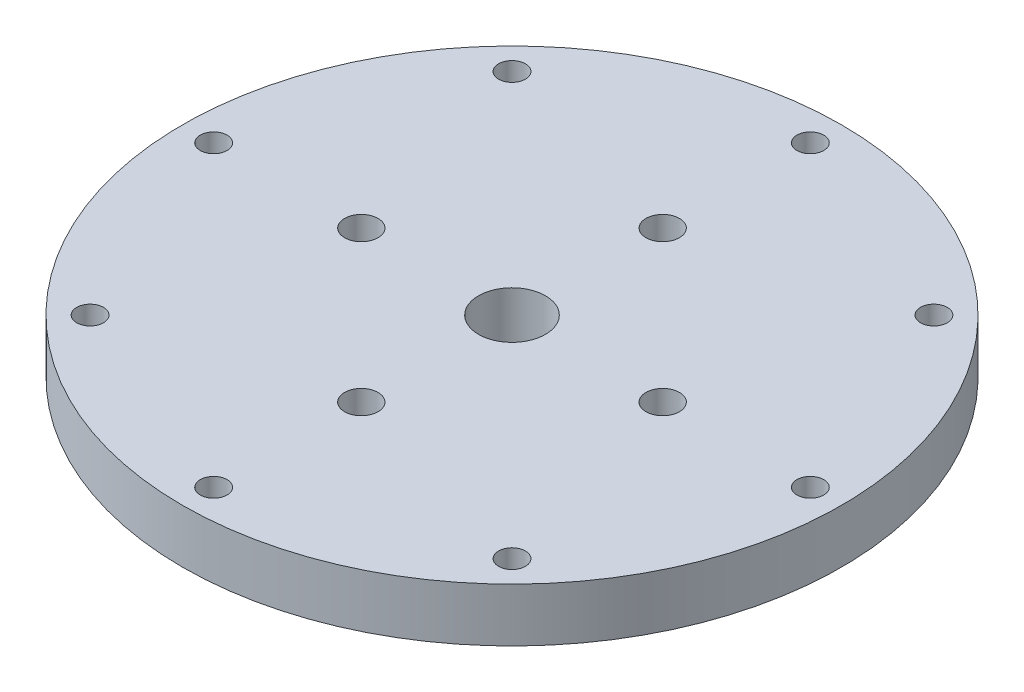
ISO-10303-21;
HEADER;
FILE_DESCRIPTION(('STEP AP214'),'2;1');
FILE_NAME('part.step','',(''),(''),'','','');
FILE_SCHEMA(('AUTOMOTIVE_DESIGN { 1 0 10303 214 1 1 1 1 }'));
ENDSEC;
DATA;
#1=APPLICATION_CONTEXT('core data for automotive mechanical design processes');
#2=APPLICATION_PROTOCOL_DEFINITION('international standard','automotive_design',2000,#1);
#3=PRODUCT_CONTEXT('',#1,'mechanical');
#4=PRODUCT('Part','Part','',(#3));
#5=PRODUCT_RELATED_PRODUCT_CATEGORY('part','',(#4));
#6=PRODUCT_DEFINITION_FORMATION('','',#4);
#7=PRODUCT_DEFINITION_CONTEXT('part definition',#1,'design');
#8=PRODUCT_DEFINITION('design','',#6,#7);
#9=PRODUCT_DEFINITION_SHAPE('','',#8);
#10=(LENGTH_UNIT() NAMED_UNIT(*) SI_UNIT(.MILLI.,.METRE.));
#11=(NAMED_UNIT(*) PLANE_ANGLE_UNIT() SI_UNIT($,.RADIAN.));
#12=(NAMED_UNIT(*) SI_UNIT($,.STERADIAN.) SOLID_ANGLE_UNIT());
#13=UNCERTAINTY_MEASURE_WITH_UNIT(LENGTH_MEASURE(1.E-05),#10,'distance_accuracy_value','');
#14=(GEOMETRIC_REPRESENTATION_CONTEXT(3) GLOBAL_UNCERTAINTY_ASSIGNED_CONTEXT((#13)) GLOBAL_UNIT_ASSIGNED_CONTEXT((#10,
#11,#12)) REPRESENTATION_CONTEXT('',''));
#15=CARTESIAN_POINT('',(0.,0.,0.));
#16=DIRECTION('',(0.,0.,1.));
#17=DIRECTION('',(1.,0.,0.));
#18=AXIS2_PLACEMENT_3D('',#15,#16,#17);
#19=CARTESIAN_POINT('',(0.,8.001,0.));
#20=DIRECTION('',(0.,1.,0.));
#21=DIRECTION('',(0.,0.,1.));
#22=AXIS2_PLACEMENT_3D('',#19,#20,#21);
#23=PLANE('',#22);
#24=CARTESIAN_POINT('',(22.5044,8.001,0.));
#25=DIRECTION('',(0.,1.,0.));
#26=DIRECTION('',(0.,0.,1.));
#27=AXIS2_PLACEMENT_3D('',#24,#25,#26);
#28=CIRCLE('',#27,2.5);
#29=CARTESIAN_POINT('',(22.5044,8.001,2.5));
#30=VERTEX_POINT('',#29);
#31=EDGE_CURVE('E107',#30,#30,#28,.T.);
#32=ORIENTED_EDGE('',*,*,#31,.F.);
#33=EDGE_LOOP('',(#32));
#34=FACE_BOUND('',#33,.T.);
#35=CARTESIAN_POINT('',(-22.5044,8.001,0.));
#36=DIRECTION('',(0.,1.,0.));
#37=DIRECTION('',(0.,0.,1.));
#38=AXIS2_PLACEMENT_3D('',#35,#36,#37);
#39=CIRCLE('',#38,2.5);
#40=CARTESIAN_POINT('',(-22.5044,8.001,2.49999999999999));
#41=VERTEX_POINT('',#40);
#42=EDGE_CURVE('E95',#41,#41,#39,.T.);
#43=ORIENTED_EDGE('',*,*,#42,.F.);
#44=EDGE_LOOP('',(#43));
#45=FACE_BOUND('',#44,.T.);
#46=CARTESIAN_POINT('',(44.5516000000001,8.001,-1.34620638304827E-12));
#47=DIRECTION('',(0.,1.,0.));
#48=DIRECTION('',(0.,0.,1.));
#49=AXIS2_PLACEMENT_3D('',#46,#47,#48);
#50=CIRCLE('',#49,2.);
#51=CARTESIAN_POINT('',(44.5516000000001,8.001,1.99999999999866));
#52=VERTEX_POINT('',#51);
#53=EDGE_CURVE('E83',#52,#52,#50,.T.);
#54=ORIENTED_EDGE('',*,*,#53,.F.);
#55=EDGE_LOOP('',(#54));
#56=FACE_BOUND('',#55,.T.);
#57=CARTESIAN_POINT('',(1.34270249413963E-12,8.001,44.5516));
#58=DIRECTION('',(0.,1.,0.));
#59=DIRECTION('',(0.,0.,1.));
#60=AXIS2_PLACEMENT_3D('',#57,#58,#59);
#61=CIRCLE('',#60,2.);
#62=CARTESIAN_POINT('',(1.34270249413963E-12,8.001,46.5516));
#63=VERTEX_POINT('',#62);
#64=EDGE_CURVE('E71',#63,#63,#61,.T.);
#65=ORIENTED_EDGE('',*,*,#64,.F.);
#66=EDGE_LOOP('',(#65));
#67=FACE_BOUND('',#66,.T.);
#68=CARTESIAN_POINT('',(-1.3163515416581E-12,8.001,-44.5516));
#69=DIRECTION('',(0.,1.,0.));
#70=DIRECTION('',(0.,0.,1.));
#71=AXIS2_PLACEMENT_3D('',#68,#69,#70);
#72=CIRCLE('',#71,2.);
#73=CARTESIAN_POINT('',(-1.3163515416581E-12,8.001,-42.5516));
#74=VERTEX_POINT('',#73);
#75=EDGE_CURVE('E59',#74,#74,#72,.T.);
#76=ORIENTED_EDGE('',*,*,#75,.F.);
#77=EDGE_LOOP('',(#76));
#78=FACE_BOUND('',#77,.T.);
#79=CARTESIAN_POINT('',(-44.5516,8.001,1.34608556417015E-12));
#80=DIRECTION('',(0.,1.,0.));
#81=DIRECTION('',(0.,0.,1.));
#82=AXIS2_PLACEMENT_3D('',#79,#80,#81);
#83=CIRCLE('',#82,2.);
#84=CARTESIAN_POINT('',(-44.5516,8.001,2.00000000000135));
#85=VERTEX_POINT('',#84);
#86=EDGE_CURVE('E47',#85,#85,#83,.T.);
#87=ORIENTED_EDGE('',*,*,#86,.F.);
#88=EDGE_LOOP('',(#87));
#89=FACE_BOUND('',#88,.T.);
#90=CARTESIAN_POINT('',(0.,8.001,0.));
#91=DIRECTION('',(0.,1.,0.));
#92=DIRECTION('',(0.,0.,1.));
#93=AXIS2_PLACEMENT_3D('',#90,#91,#92);
#94=CIRCLE('',#93,49.2125);
#95=CARTESIAN_POINT('',(0.,8.001,49.2125));
#96=VERTEX_POINT('',#95);
#97=EDGE_CURVE('E10',#96,#96,#94,.T.);
#98=ORIENTED_EDGE('',*,*,#97,.T.);
#99=EDGE_LOOP('',(#98));
#100=FACE_BOUND('',#99,.T.);
#101=CARTESIAN_POINT('',(0.,8.001,0.));
#102=DIRECTION('',(0.,1.,0.));
#103=DIRECTION('',(0.,0.,1.));
#104=AXIS2_PLACEMENT_3D('',#101,#102,#103);
#105=CIRCLE('',#104,5.);
#106=CARTESIAN_POINT('',(0.,8.001,5.));
#107=VERTEX_POINT('',#106);
#108=EDGE_CURVE('E42',#107,#107,#105,.T.);
#109=ORIENTED_EDGE('',*,*,#108,.F.);
#110=EDGE_LOOP('',(#109));
#111=FACE_BOUND('',#110,.T.);
#112=CARTESIAN_POINT('',(-31.5027384727116,8.001,-31.5027384727096));
#113=DIRECTION('',(0.,1.,0.));
#114=DIRECTION('',(0.,0.,1.));
#115=AXIS2_PLACEMENT_3D('',#112,#113,#114);
#116=CIRCLE('',#115,2.);
#117=CARTESIAN_POINT('',(-31.5027384727116,8.001,-29.5027384727096));
#118=VERTEX_POINT('',#117);
#119=EDGE_CURVE('E53',#118,#118,#116,.T.);
#120=ORIENTED_EDGE('',*,*,#119,.F.);
#121=EDGE_LOOP('',(#120));
#122=FACE_BOUND('',#121,.T.);
#123=CARTESIAN_POINT('',(-31.5027384727097,8.001,31.5027384727116));
#124=DIRECTION('',(0.,1.,0.));
#125=DIRECTION('',(0.,0.,1.));
#126=AXIS2_PLACEMENT_3D('',#123,#124,#125);
#127=CIRCLE('',#126,2.);
#128=CARTESIAN_POINT('',(-31.5027384727097,8.001,33.5027384727116));
#129=VERTEX_POINT('',#128);
#130=EDGE_CURVE('E65',#129,#129,#127,.T.);
#131=ORIENTED_EDGE('',*,*,#130,.F.);
#132=EDGE_LOOP('',(#131));
#133=FACE_BOUND('',#132,.T.);
#134=CARTESIAN_POINT('',(31.5027384727116,8.001,31.5027384727097));
#135=DIRECTION('',(0.,1.,0.));
#136=DIRECTION('',(0.,0.,1.));
#137=AXIS2_PLACEMENT_3D('',#134,#135,#136);
#138=CIRCLE('',#137,2.);
#139=CARTESIAN_POINT('',(31.5027384727116,8.001,33.5027384727097));
#140=VERTEX_POINT('',#139);
#141=EDGE_CURVE('E77',#140,#140,#138,.T.);
#142=ORIENTED_EDGE('',*,*,#141,.F.);
#143=EDGE_LOOP('',(#142));
#144=FACE_BOUND('',#143,.T.);
#145=CARTESIAN_POINT('',(31.5027384727097,8.001,-31.5027384727115));
#146=DIRECTION('',(0.,1.,0.));
#147=DIRECTION('',(0.,0.,1.));
#148=AXIS2_PLACEMENT_3D('',#145,#146,#147);
#149=CIRCLE('',#148,2.);
#150=CARTESIAN_POINT('',(31.5027384727097,8.001,-29.5027384727115));
#151=VERTEX_POINT('',#150);
#152=EDGE_CURVE('E89',#151,#151,#149,.T.);
#153=ORIENTED_EDGE('',*,*,#152,.F.);
#154=EDGE_LOOP('',(#153));
#155=FACE_BOUND('',#154,.T.);
#156=CARTESIAN_POINT('',(0.,8.001,-22.5044));
#157=DIRECTION('',(0.,1.,0.));
#158=DIRECTION('',(0.,0.,1.));
#159=AXIS2_PLACEMENT_3D('',#156,#157,#158);
#160=CIRCLE('',#159,2.5);
#161=CARTESIAN_POINT('',(0.,8.001,-20.0044));
#162=VERTEX_POINT('',#161);
#163=EDGE_CURVE('E101',#162,#162,#160,.T.);
#164=ORIENTED_EDGE('',*,*,#163,.F.);
#165=EDGE_LOOP('',(#164));
#166=FACE_BOUND('',#165,.T.);
#167=CARTESIAN_POINT('',(0.,8.001,22.5044));
#168=DIRECTION('',(0.,1.,0.));
#169=DIRECTION('',(0.,0.,1.));
#170=AXIS2_PLACEMENT_3D('',#167,#168,#169);
#171=CIRCLE('',#170,2.5);
#172=CARTESIAN_POINT('',(0.,8.001,25.0044));
#173=VERTEX_POINT('',#172);
#174=EDGE_CURVE('E113',#173,#173,#171,.T.);
#175=ORIENTED_EDGE('',*,*,#174,.F.);
#176=EDGE_LOOP('',(#175));
#177=FACE_BOUND('',#176,.T.);
#178=ADVANCED_FACE('F31',(#34,#45,#56,#67,#78,#89,#100,#111,#122,#133,#144,#155,#166,#177),#23,.T.);
#179=CARTESIAN_POINT('',(0.,0.,0.));
#180=DIRECTION('',(0.,1.,0.));
#181=DIRECTION('',(0.,0.,1.));
#182=AXIS2_PLACEMENT_3D('',#179,#180,#181);
#183=PLANE('',#182);
#184=CARTESIAN_POINT('',(0.,0.,0.));
#185=DIRECTION('',(0.,1.,0.));
#186=DIRECTION('',(0.,0.,1.));
#187=AXIS2_PLACEMENT_3D('',#184,#185,#186);
#188=CIRCLE('',#187,49.2125);
#189=CARTESIAN_POINT('',(0.,0.,49.2125));
#190=VERTEX_POINT('',#189);
#191=EDGE_CURVE('E35',#190,#190,#188,.T.);
#192=ORIENTED_EDGE('',*,*,#191,.F.);
#193=EDGE_LOOP('',(#192));
#194=FACE_BOUND('',#193,.T.);
#195=CARTESIAN_POINT('',(0.,0.,0.));
#196=DIRECTION('',(0.,1.,0.));
#197=DIRECTION('',(0.,0.,1.));
#198=AXIS2_PLACEMENT_3D('',#195,#196,#197);
#199=CIRCLE('',#198,5.);
#200=CARTESIAN_POINT('',(0.,0.,5.));
#201=VERTEX_POINT('',#200);
#202=EDGE_CURVE('E44',#201,#201,#199,.T.);
#203=ORIENTED_EDGE('',*,*,#202,.T.);
#204=EDGE_LOOP('',(#203));
#205=FACE_BOUND('',#204,.T.);
#206=CARTESIAN_POINT('',(-44.5516,0.,1.34608556417015E-12));
#207=DIRECTION('',(0.,1.,0.));
#208=DIRECTION('',(0.,0.,1.));
#209=AXIS2_PLACEMENT_3D('',#206,#207,#208);
#210=CIRCLE('',#209,2.);
#211=CARTESIAN_POINT('',(-44.5516,0.,2.00000000000135));
#212=VERTEX_POINT('',#211);
#213=EDGE_CURVE('E50',#212,#212,#210,.T.);
#214=ORIENTED_EDGE('',*,*,#213,.T.);
#215=EDGE_LOOP('',(#214));
#216=FACE_BOUND('',#215,.T.);
#217=CARTESIAN_POINT('',(-31.5027384727116,0.,-31.5027384727096));
#218=DIRECTION('',(0.,1.,0.));
#219=DIRECTION('',(0.,0.,1.));
#220=AXIS2_PLACEMENT_3D('',#217,#218,#219);
#221=CIRCLE('',#220,2.);
#222=CARTESIAN_POINT('',(-31.5027384727116,0.,-29.5027384727096));
#223=VERTEX_POINT('',#222);
#224=EDGE_CURVE('E56',#223,#223,#221,.T.);
#225=ORIENTED_EDGE('',*,*,#224,.T.);
#226=EDGE_LOOP('',(#225));
#227=FACE_BOUND('',#226,.T.);
#228=CARTESIAN_POINT('',(-1.3163515416581E-12,0.,-44.5516));
#229=DIRECTION('',(0.,1.,0.));
#230=DIRECTION('',(0.,0.,1.));
#231=AXIS2_PLACEMENT_3D('',#228,#229,#230);
#232=CIRCLE('',#231,2.);
#233=CARTESIAN_POINT('',(-1.3163515416581E-12,0.,-42.5516));
#234=VERTEX_POINT('',#233);
#235=EDGE_CURVE('E62',#234,#234,#232,.T.);
#236=ORIENTED_EDGE('',*,*,#235,.T.);
#237=EDGE_LOOP('',(#236));
#238=FACE_BOUND('',#237,.T.);
#239=CARTESIAN_POINT('',(-31.5027384727097,0.,31.5027384727116));
#240=DIRECTION('',(0.,1.,0.));
#241=DIRECTION('',(0.,0.,1.));
#242=AXIS2_PLACEMENT_3D('',#239,#240,#241);
#243=CIRCLE('',#242,2.);
#244=CARTESIAN_POINT('',(-31.5027384727097,0.,33.5027384727116));
#245=VERTEX_POINT('',#244);
#246=EDGE_CURVE('E68',#245,#245,#243,.T.);
#247=ORIENTED_EDGE('',*,*,#246,.T.);
#248=EDGE_LOOP('',(#247));
#249=FACE_BOUND('',#248,.T.);
#250=CARTESIAN_POINT('',(1.34270249413963E-12,0.,44.5516));
#251=DIRECTION('',(0.,1.,0.));
#252=DIRECTION('',(0.,0.,1.));
#253=AXIS2_PLACEMENT_3D('',#250,#251,#252);
#254=CIRCLE('',#253,2.);
#255=CARTESIAN_POINT('',(1.34270249413963E-12,0.,46.5516));
#256=VERTEX_POINT('',#255);
#257=EDGE_CURVE('E74',#256,#256,#254,.T.);
#258=ORIENTED_EDGE('',*,*,#257,.T.);
#259=EDGE_LOOP('',(#258));
#260=FACE_BOUND('',#259,.T.);
#261=CARTESIAN_POINT('',(31.5027384727116,0.,31.5027384727097));
#262=DIRECTION('',(0.,1.,0.));
#263=DIRECTION('',(0.,0.,1.));
#264=AXIS2_PLACEMENT_3D('',#261,#262,#263);
#265=CIRCLE('',#264,2.);
#266=CARTESIAN_POINT('',(31.5027384727116,0.,33.5027384727097));
#267=VERTEX_POINT('',#266);
#268=EDGE_CURVE('E80',#267,#267,#265,.T.);
#269=ORIENTED_EDGE('',*,*,#268,.T.);
#270=EDGE_LOOP('',(#269));
#271=FACE_BOUND('',#270,.T.);
#272=CARTESIAN_POINT('',(44.5516000000001,0.,-1.34620638304827E-12));
#273=DIRECTION('',(0.,1.,0.));
#274=DIRECTION('',(0.,0.,1.));
#275=AXIS2_PLACEMENT_3D('',#272,#273,#274);
#276=CIRCLE('',#275,2.);
#277=CARTESIAN_POINT('',(44.5516000000001,0.,1.99999999999866));
#278=VERTEX_POINT('',#277);
#279=EDGE_CURVE('E86',#278,#278,#276,.T.);
#280=ORIENTED_EDGE('',*,*,#279,.T.);
#281=EDGE_LOOP('',(#280));
#282=FACE_BOUND('',#281,.T.);
#283=CARTESIAN_POINT('',(31.5027384727097,0.,-31.5027384727115));
#284=DIRECTION('',(0.,1.,0.));
#285=DIRECTION('',(0.,0.,1.));
#286=AXIS2_PLACEMENT_3D('',#283,#284,#285);
#287=CIRCLE('',#286,2.);
#288=CARTESIAN_POINT('',(31.5027384727097,0.,-29.5027384727115));
#289=VERTEX_POINT('',#288);
#290=EDGE_CURVE('E92',#289,#289,#287,.T.);
#291=ORIENTED_EDGE('',*,*,#290,.T.);
#292=EDGE_LOOP('',(#291));
#293=FACE_BOUND('',#292,.T.);
#294=CARTESIAN_POINT('',(-22.5044,0.,0.));
#295=DIRECTION('',(0.,1.,0.));
#296=DIRECTION('',(0.,0.,1.));
#297=AXIS2_PLACEMENT_3D('',#294,#295,#296);
#298=CIRCLE('',#297,2.5);
#299=CARTESIAN_POINT('',(-22.5044,0.,2.49999999999999));
#300=VERTEX_POINT('',#299);
#301=EDGE_CURVE('E98',#300,#300,#298,.T.);
#302=ORIENTED_EDGE('',*,*,#301,.T.);
#303=EDGE_LOOP('',(#302));
#304=FACE_BOUND('',#303,.T.);
#305=CARTESIAN_POINT('',(0.,0.,-22.5044));
#306=DIRECTION('',(0.,1.,0.));
#307=DIRECTION('',(0.,0.,1.));
#308=AXIS2_PLACEMENT_3D('',#305,#306,#307);
#309=CIRCLE('',#308,2.5);
#310=CARTESIAN_POINT('',(0.,0.,-20.0044));
#311=VERTEX_POINT('',#310);
#312=EDGE_CURVE('E104',#311,#311,#309,.T.);
#313=ORIENTED_EDGE('',*,*,#312,.T.);
#314=EDGE_LOOP('',(#313));
#315=FACE_BOUND('',#314,.T.);
#316=CARTESIAN_POINT('',(22.5044,0.,0.));
#317=DIRECTION('',(0.,1.,0.));
#318=DIRECTION('',(0.,0.,1.));
#319=AXIS2_PLACEMENT_3D('',#316,#317,#318);
#320=CIRCLE('',#319,2.5);
#321=CARTESIAN_POINT('',(22.5044,0.,2.5));
#322=VERTEX_POINT('',#321);
#323=EDGE_CURVE('E110',#322,#322,#320,.T.);
#324=ORIENTED_EDGE('',*,*,#323,.T.);
#325=EDGE_LOOP('',(#324));
#326=FACE_BOUND('',#325,.T.);
#327=CARTESIAN_POINT('',(0.,0.,22.5044));
#328=DIRECTION('',(0.,1.,0.));
#329=DIRECTION('',(0.,0.,1.));
#330=AXIS2_PLACEMENT_3D('',#327,#328,#329);
#331=CIRCLE('',#330,2.5);
#332=CARTESIAN_POINT('',(0.,0.,25.0044));
#333=VERTEX_POINT('',#332);
#334=EDGE_CURVE('E116',#333,#333,#331,.T.);
#335=ORIENTED_EDGE('',*,*,#334,.T.);
#336=EDGE_LOOP('',(#335));
#337=FACE_BOUND('',#336,.T.);
#338=ADVANCED_FACE('F126',(#194,#205,#216,#227,#238,#249,#260,#271,#282,#293,#304,#315,#326,
#337),#183,.F.);
#339=CARTESIAN_POINT('',(0.,8.001,0.));
#340=DIRECTION('',(0.,-1.,0.));
#341=DIRECTION('',(0.,0.,-1.));
#342=AXIS2_PLACEMENT_3D('',#339,#340,#341);
#343=CYLINDRICAL_SURFACE('',#342,49.2125);
#344=ORIENTED_EDGE('',*,*,#97,.F.);
#345=EDGE_LOOP('',(#344));
#346=FACE_BOUND('',#345,.T.);
#347=ORIENTED_EDGE('',*,*,#191,.T.);
#348=EDGE_LOOP('',(#347));
#349=FACE_BOUND('',#348,.T.);
#350=ADVANCED_FACE('F33',(#346,#349),#343,.T.);
#351=CARTESIAN_POINT('',(0.,8.001,0.));
#352=DIRECTION('',(0.,-1.,0.));
#353=DIRECTION('',(0.,0.,-1.));
#354=AXIS2_PLACEMENT_3D('',#351,#352,#353);
#355=CYLINDRICAL_SURFACE('',#354,5.);
#356=ORIENTED_EDGE('',*,*,#108,.T.);
#357=EDGE_LOOP('',(#356));
#358=FACE_BOUND('',#357,.T.);
#359=ORIENTED_EDGE('',*,*,#202,.F.);
#360=EDGE_LOOP('',(#359));
#361=FACE_BOUND('',#360,.T.);
#362=ADVANCED_FACE('F136',(#358,#361),#355,.F.);
#363=CARTESIAN_POINT('',(-44.5516,8.001,1.34608556417015E-12));
#364=DIRECTION('',(0.,-1.,0.));
#365=DIRECTION('',(0.,0.,-1.));
#366=AXIS2_PLACEMENT_3D('',#363,#364,#365);
#367=CYLINDRICAL_SURFACE('',#366,2.);
#368=ORIENTED_EDGE('',*,*,#86,.T.);
#369=EDGE_LOOP('',(#368));
#370=FACE_BOUND('',#369,.T.);
#371=ORIENTED_EDGE('',*,*,#213,.F.);
#372=EDGE_LOOP('',(#371));
#373=FACE_BOUND('',#372,.T.);
#374=ADVANCED_FACE('F139',(#370,#373),#367,.F.);
#375=CARTESIAN_POINT('',(-31.5027384727116,8.001,-31.5027384727096));
#376=DIRECTION('',(0.,-1.,0.));
#377=DIRECTION('',(0.,0.,-1.));
#378=AXIS2_PLACEMENT_3D('',#375,#376,#377);
#379=CYLINDRICAL_SURFACE('',#378,2.);
#380=ORIENTED_EDGE('',*,*,#119,.T.);
#381=EDGE_LOOP('',(#380));
#382=FACE_BOUND('',#381,.T.);
#383=ORIENTED_EDGE('',*,*,#224,.F.);
#384=EDGE_LOOP('',(#383));
#385=FACE_BOUND('',#384,.T.);
#386=ADVANCED_FACE('F143',(#382,#385),#379,.F.);
#387=CARTESIAN_POINT('',(-1.3163515416581E-12,8.001,-44.5516));
#388=DIRECTION('',(0.,-1.,0.));
#389=DIRECTION('',(0.,0.,-1.));
#390=AXIS2_PLACEMENT_3D('',#387,#388,#389);
#391=CYLINDRICAL_SURFACE('',#390,2.);
#392=ORIENTED_EDGE('',*,*,#75,.T.);
#393=EDGE_LOOP('',(#392));
#394=FACE_BOUND('',#393,.T.);
#395=ORIENTED_EDGE('',*,*,#235,.F.);
#396=EDGE_LOOP('',(#395));
#397=FACE_BOUND('',#396,.T.);
#398=ADVANCED_FACE('F147',(#394,#397),#391,.F.);
#399=CARTESIAN_POINT('',(-31.5027384727097,8.001,31.5027384727116));
#400=DIRECTION('',(0.,-1.,0.));
#401=DIRECTION('',(0.,0.,-1.));
#402=AXIS2_PLACEMENT_3D('',#399,#400,#401);
#403=CYLINDRICAL_SURFACE('',#402,2.);
#404=ORIENTED_EDGE('',*,*,#130,.T.);
#405=EDGE_LOOP('',(#404));
#406=FACE_BOUND('',#405,.T.);
#407=ORIENTED_EDGE('',*,*,#246,.F.);
#408=EDGE_LOOP('',(#407));
#409=FACE_BOUND('',#408,.T.);
#410=ADVANCED_FACE('F151',(#406,#409),#403,.F.);
#411=CARTESIAN_POINT('',(1.34270249413963E-12,8.001,44.5516));
#412=DIRECTION('',(0.,-1.,0.));
#413=DIRECTION('',(0.,0.,-1.));
#414=AXIS2_PLACEMENT_3D('',#411,#412,#413);
#415=CYLINDRICAL_SURFACE('',#414,2.);
#416=ORIENTED_EDGE('',*,*,#64,.T.);
#417=EDGE_LOOP('',(#416));
#418=FACE_BOUND('',#417,.T.);
#419=ORIENTED_EDGE('',*,*,#257,.F.);
#420=EDGE_LOOP('',(#419));
#421=FACE_BOUND('',#420,.T.);
#422=ADVANCED_FACE('F155',(#418,#421),#415,.F.);
#423=CARTESIAN_POINT('',(31.5027384727116,8.001,31.5027384727097));
#424=DIRECTION('',(0.,-1.,0.));
#425=DIRECTION('',(0.,0.,-1.));
#426=AXIS2_PLACEMENT_3D('',#423,#424,#425);
#427=CYLINDRICAL_SURFACE('',#426,2.);
#428=ORIENTED_EDGE('',*,*,#141,.T.);
#429=EDGE_LOOP('',(#428));
#430=FACE_BOUND('',#429,.T.);
#431=ORIENTED_EDGE('',*,*,#268,.F.);
#432=EDGE_LOOP('',(#431));
#433=FACE_BOUND('',#432,.T.);
#434=ADVANCED_FACE('F159',(#430,#433),#427,.F.);
#435=CARTESIAN_POINT('',(44.5516000000001,8.001,-1.34620638304827E-12));
#436=DIRECTION('',(0.,-1.,0.));
#437=DIRECTION('',(0.,0.,-1.));
#438=AXIS2_PLACEMENT_3D('',#435,#436,#437);
#439=CYLINDRICAL_SURFACE('',#438,2.);
#440=ORIENTED_EDGE('',*,*,#53,.T.);
#441=EDGE_LOOP('',(#440));
#442=FACE_BOUND('',#441,.T.);
#443=ORIENTED_EDGE('',*,*,#279,.F.);
#444=EDGE_LOOP('',(#443));
#445=FACE_BOUND('',#444,.T.);
#446=ADVANCED_FACE('F163',(#442,#445),#439,.F.);
#447=CARTESIAN_POINT('',(31.5027384727097,8.001,-31.5027384727115));
#448=DIRECTION('',(0.,-1.,0.));
#449=DIRECTION('',(0.,0.,-1.));
#450=AXIS2_PLACEMENT_3D('',#447,#448,#449);
#451=CYLINDRICAL_SURFACE('',#450,2.);
#452=ORIENTED_EDGE('',*,*,#152,.T.);
#453=EDGE_LOOP('',(#452));
#454=FACE_BOUND('',#453,.T.);
#455=ORIENTED_EDGE('',*,*,#290,.F.);
#456=EDGE_LOOP('',(#455));
#457=FACE_BOUND('',#456,.T.);
#458=ADVANCED_FACE('F167',(#454,#457),#451,.F.);
#459=CARTESIAN_POINT('',(-22.5044,8.001,0.));
#460=DIRECTION('',(0.,-1.,0.));
#461=DIRECTION('',(0.,0.,-1.));
#462=AXIS2_PLACEMENT_3D('',#459,#460,#461);
#463=CYLINDRICAL_SURFACE('',#462,2.5);
#464=ORIENTED_EDGE('',*,*,#42,.T.);
#465=EDGE_LOOP('',(#464));
#466=FACE_BOUND('',#465,.T.);
#467=ORIENTED_EDGE('',*,*,#301,.F.);
#468=EDGE_LOOP('',(#467));
#469=FACE_BOUND('',#468,.T.);
#470=ADVANCED_FACE('F171',(#466,#469),#463,.F.);
#471=CARTESIAN_POINT('',(0.,8.001,-22.5044));
#472=DIRECTION('',(0.,-1.,0.));
#473=DIRECTION('',(0.,0.,-1.));
#474=AXIS2_PLACEMENT_3D('',#471,#472,#473);
#475=CYLINDRICAL_SURFACE('',#474,2.5);
#476=ORIENTED_EDGE('',*,*,#163,.T.);
#477=EDGE_LOOP('',(#476));
#478=FACE_BOUND('',#477,.T.);
#479=ORIENTED_EDGE('',*,*,#312,.F.);
#480=EDGE_LOOP('',(#479));
#481=FACE_BOUND('',#480,.T.);
#482=ADVANCED_FACE('F175',(#478,#481),#475,.F.);
#483=CARTESIAN_POINT('',(22.5044,8.001,0.));
#484=DIRECTION('',(0.,-1.,0.));
#485=DIRECTION('',(0.,0.,-1.));
#486=AXIS2_PLACEMENT_3D('',#483,#484,#485);
#487=CYLINDRICAL_SURFACE('',#486,2.5);
#488=ORIENTED_EDGE('',*,*,#31,.T.);
#489=EDGE_LOOP('',(#488));
#490=FACE_BOUND('',#489,.T.);
#491=ORIENTED_EDGE('',*,*,#323,.F.);
#492=EDGE_LOOP('',(#491));
#493=FACE_BOUND('',#492,.T.);
#494=ADVANCED_FACE('F179',(#490,#493),#487,.F.);
#495=CARTESIAN_POINT('',(0.,8.001,22.5044));
#496=DIRECTION('',(0.,-1.,0.));
#497=DIRECTION('',(0.,0.,-1.));
#498=AXIS2_PLACEMENT_3D('',#495,#496,#497);
#499=CYLINDRICAL_SURFACE('',#498,2.5);
#500=ORIENTED_EDGE('',*,*,#174,.T.);
#501=EDGE_LOOP('',(#500));
#502=FACE_BOUND('',#501,.T.);
#503=ORIENTED_EDGE('',*,*,#334,.F.);
#504=EDGE_LOOP('',(#503));
#505=FACE_BOUND('',#504,.T.);
#506=ADVANCED_FACE('F122',(#502,#505),#499,.F.);
#507=CLOSED_SHELL('',(#178,#338,#350,#362,#374,#386,#398,#410,#422,#434,#446,#458,#470,#482,
#494,#506));
#508=MANIFOLD_SOLID_BREP('B2',#507);
#509=ADVANCED_BREP_SHAPE_REPRESENTATION('',(#18,#508),#14);
#510=SHAPE_DEFINITION_REPRESENTATION(#9,#509);
ENDSEC;
END-ISO-10303-21;
